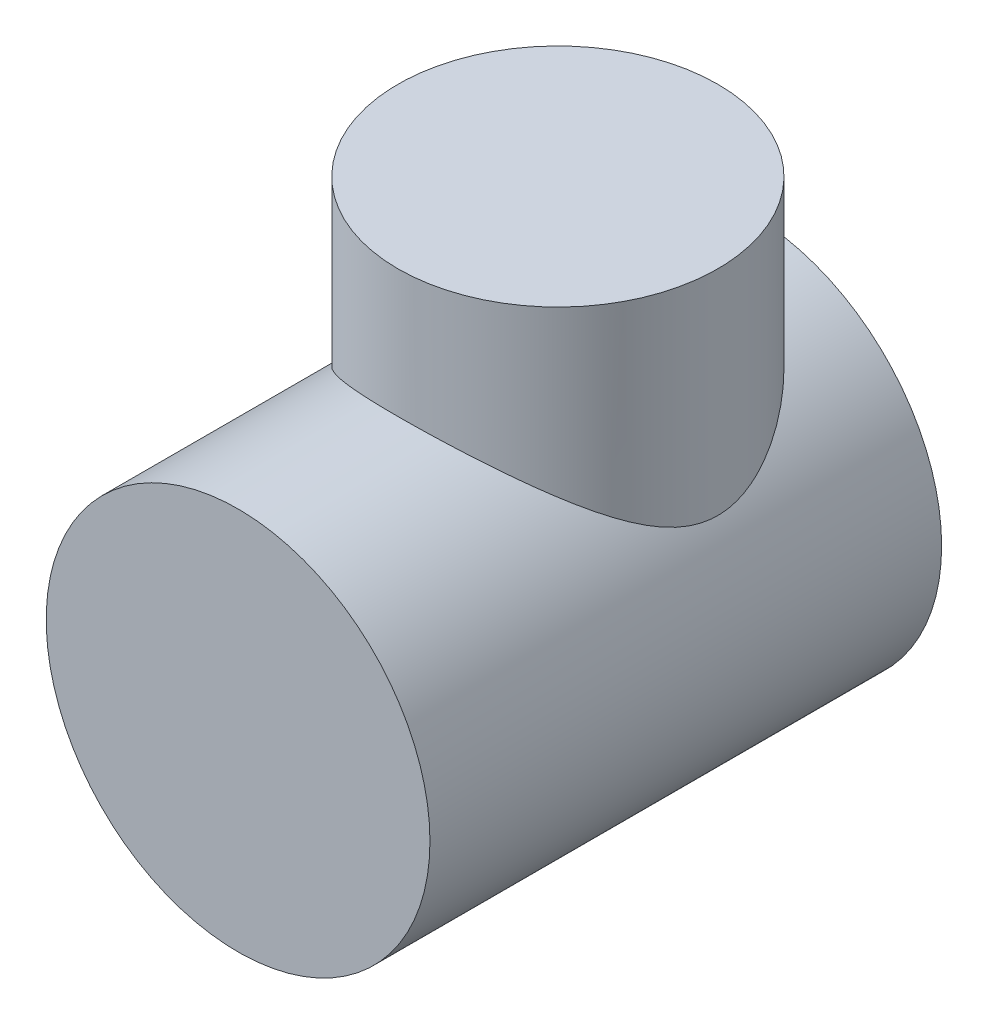
ISO-10303-21;
HEADER;
FILE_DESCRIPTION(('STEP AP214'),'2;1');
FILE_NAME('part.step','',(''),(''),'','','');
FILE_SCHEMA(('AUTOMOTIVE_DESIGN { 1 0 10303 214 1 1 1 1 }'));
ENDSEC;
DATA;
#1=APPLICATION_CONTEXT('core data for automotive mechanical design processes');
#2=APPLICATION_PROTOCOL_DEFINITION('international standard','automotive_design',2000,#1);
#3=PRODUCT_CONTEXT('',#1,'mechanical');
#4=PRODUCT('Part','Part','',(#3));
#5=PRODUCT_RELATED_PRODUCT_CATEGORY('part','',(#4));
#6=PRODUCT_DEFINITION_FORMATION('','',#4);
#7=PRODUCT_DEFINITION_CONTEXT('part definition',#1,'design');
#8=PRODUCT_DEFINITION('design','',#6,#7);
#9=PRODUCT_DEFINITION_SHAPE('','',#8);
#10=(LENGTH_UNIT() NAMED_UNIT(*) SI_UNIT(.MILLI.,.METRE.));
#11=(NAMED_UNIT(*) PLANE_ANGLE_UNIT() SI_UNIT($,.RADIAN.));
#12=(NAMED_UNIT(*) SI_UNIT($,.STERADIAN.) SOLID_ANGLE_UNIT());
#13=UNCERTAINTY_MEASURE_WITH_UNIT(LENGTH_MEASURE(1.E-05),#10,'distance_accuracy_value','');
#14=(GEOMETRIC_REPRESENTATION_CONTEXT(3) GLOBAL_UNCERTAINTY_ASSIGNED_CONTEXT((#13)) GLOBAL_UNIT_ASSIGNED_CONTEXT((#10,
#11,#12)) REPRESENTATION_CONTEXT('',''));
#15=CARTESIAN_POINT('',(0.,0.,0.));
#16=DIRECTION('',(0.,0.,1.));
#17=DIRECTION('',(1.,0.,0.));
#18=AXIS2_PLACEMENT_3D('',#15,#16,#17);
#19=CARTESIAN_POINT('',(0.,0.,800.));
#20=DIRECTION('',(0.,0.,-1.));
#21=DIRECTION('',(-1.,0.,0.));
#22=AXIS2_PLACEMENT_3D('',#19,#20,#21);
#23=CYLINDRICAL_SURFACE('',#22,300.);
#24=CARTESIAN_POINT('',(0.,0.,800.));
#25=DIRECTION('',(0.,0.,1.));
#26=DIRECTION('',(1.,0.,0.));
#27=AXIS2_PLACEMENT_3D('',#24,#25,#26);
#28=CIRCLE('',#27,300.);
#29=CARTESIAN_POINT('',(300.,0.,800.));
#30=VERTEX_POINT('',#29);
#31=EDGE_CURVE('E47',#30,#30,#28,.T.);
#32=ORIENTED_EDGE('',*,*,#31,.F.);
#33=EDGE_LOOP('',(#32));
#34=FACE_BOUND('',#33,.T.);
#35=CARTESIAN_POINT('',(0.,0.,0.));
#36=DIRECTION('',(0.,0.,1.));
#37=DIRECTION('',(1.,0.,0.));
#38=AXIS2_PLACEMENT_3D('',#35,#36,#37);
#39=CIRCLE('',#38,300.);
#40=CARTESIAN_POINT('',(300.,0.,0.));
#41=VERTEX_POINT('',#40);
#42=EDGE_CURVE('E51',#41,#41,#39,.T.);
#43=ORIENTED_EDGE('',*,*,#42,.T.);
#44=EDGE_LOOP('',(#43));
#45=FACE_BOUND('',#44,.T.);
#46=CARTESIAN_POINT('',(0.,300.,50.));
#47=CARTESIAN_POINT('',(-2.96930008322572,299.999997948122,50.0000021093179));
#48=CARTESIAN_POINT('',(-5.93866364297093,299.955892707344,50.0529235240156));
#49=CARTESIAN_POINT('',(-11.8710658877174,299.779726990274,50.2643636130296));
#50=CARTESIAN_POINT('',(-14.834104375777,299.647663814209,50.4228855286365));
#51=CARTESIAN_POINT('',(-20.7478044802737,299.296346726225,50.844793719791));
#52=CARTESIAN_POINT('',(-23.6984648726171,299.07708438727,51.1081901305421));
#53=CARTESIAN_POINT('',(-29.5809762718701,298.552651445318,51.738613006228));
#54=CARTESIAN_POINT('',(-32.5128274219459,298.247481497,52.105638681431));
#55=CARTESIAN_POINT('',(-38.3535997225993,297.552778243481,52.9418893509768));
#56=CARTESIAN_POINT('',(-41.2625065157751,297.163195881416,53.4111737746085));
#57=CARTESIAN_POINT('',(-47.0501391230999,296.301947678224,54.4497436275312));
#58=CARTESIAN_POINT('',(-49.928864851909,295.830281605062,55.0190293395046));
#59=CARTESIAN_POINT('',(-55.6509171431975,294.807432763001,56.2551685649678));
#60=CARTESIAN_POINT('',(-58.494244542241,294.256251877155,56.9220197679378));
#61=CARTESIAN_POINT('',(-64.1408518505144,293.077242087509,58.3506000143364));
#62=CARTESIAN_POINT('',(-66.9441317990373,292.44941325892,59.1123289646677));
#63=CARTESIAN_POINT('',(-72.4894596989027,291.124295763298,60.722830725313));
#64=CARTESIAN_POINT('',(-75.2317763810829,290.427452812313,61.57104591116));
#65=CARTESIAN_POINT('',(-80.6688953530328,288.964453027639,63.3552960600545));
#66=CARTESIAN_POINT('',(-83.3636977107917,288.19829629314,64.291330897427));
#67=CARTESIAN_POINT('',(-88.7023935412724,286.600155550027,66.2480634695666));
#68=CARTESIAN_POINT('',(-91.3462890326043,285.768174158268,67.2687578387748));
#69=CARTESIAN_POINT('',(-96.5804336043644,284.041923083725,69.391683177828));
#70=CARTESIAN_POINT('',(-99.1706825108278,283.147653198992,70.493914412027));
#71=CARTESIAN_POINT('',(-104.295384029534,281.300360145109,72.7768881771682));
#72=CARTESIAN_POINT('',(-106.829830040222,280.347330074696,73.9576399314666));
#73=CARTESIAN_POINT('',(-111.84052450075,278.386305967491,76.3944132869171));
#74=CARTESIAN_POINT('',(-114.316773527055,277.378312475462,77.6504341420597));
#75=CARTESIAN_POINT('',(-119.209636970705,275.310945245439,80.2348572131202));
#76=CARTESIAN_POINT('',(-121.626245765144,274.251566690549,81.5632662162319));
#77=CARTESIAN_POINT('',(-126.398247631344,272.085189052158,84.2894653650219));
#78=CARTESIAN_POINT('',(-128.753638405936,270.978188185786,85.687258108572));
#79=CARTESIAN_POINT('',(-134.256259318215,268.30531289465,89.0753970757047));
#80=CARTESIAN_POINT('',(-137.376412729716,266.720297528871,91.0947411250758));
#81=CARTESIAN_POINT('',(-143.498088466576,263.477320890871,95.2514004643173));
#82=CARTESIAN_POINT('',(-146.499602379744,261.819354463573,97.3887240939275));
#83=CARTESIAN_POINT('',(-152.383317841824,258.43923508653,101.775898224341));
#84=CARTESIAN_POINT('',(-155.265485743067,256.71706429199,104.025780069598));
#85=CARTESIAN_POINT('',(-160.908710429854,253.218105778097,108.632151889252));
#86=CARTESIAN_POINT('',(-163.669769376234,251.44131903417,110.988639960045));
#87=CARTESIAN_POINT('',(-169.077158639631,247.837643031533,115.809696084667));
#88=CARTESIAN_POINT('',(-171.723184868089,246.01063961813,118.27451961817));
#89=CARTESIAN_POINT('',(-176.892986797946,242.319950098432,123.302873878106));
#90=CARTESIAN_POINT('',(-179.416761872879,240.456263804229,125.866405110238));
#91=CARTESIAN_POINT('',(-184.341658658744,236.701793334697,131.088683117942));
#92=CARTESIAN_POINT('',(-186.742798038185,234.811013113426,133.747416083076));
#93=CARTESIAN_POINT('',(-191.422795724422,231.011682441645,139.158127078872));
#94=CARTESIAN_POINT('',(-193.701653929733,229.103131976388,141.910105186918));
#95=CARTESIAN_POINT('',(-198.177775864621,225.243118574277,147.557260728734));
#96=CARTESIAN_POINT('',(-200.372767360237,223.291512102017,150.454141159526));
#97=CARTESIAN_POINT('',(-204.635460679348,219.391597153672,156.342285839977));
#98=CARTESIAN_POINT('',(-206.70316147619,217.443288704311,159.333550850594));
#99=CARTESIAN_POINT('',(-210.711219284542,213.561623952982,165.411594994307));
#100=CARTESIAN_POINT('',(-212.651531745019,211.628273088409,168.498406993174));
#101=CARTESIAN_POINT('',(-216.402739934711,207.790887124252,174.767427081435));
#102=CARTESIAN_POINT('',(-218.213637285177,205.886851657653,177.949633975059));
#103=CARTESIAN_POINT('',(-221.699926748241,202.127922853598,184.403450928727));
#104=CARTESIAN_POINT('',(-223.375631121733,200.272923338017,187.674830170698));
#105=CARTESIAN_POINT('',(-226.593568489109,196.624694948907,194.316639258371));
#106=CARTESIAN_POINT('',(-228.135794388486,194.831469361769,197.687074356249));
#107=CARTESIAN_POINT('',(-231.081703037206,191.328199766915,204.526955299351));
#108=CARTESIAN_POINT('',(-232.485483671598,189.618097428702,207.996328921917));
#109=CARTESIAN_POINT('',(-235.150262749465,186.303182455405,215.038113213859));
#110=CARTESIAN_POINT('',(-236.411287288404,184.698350599765,218.610504901494));
#111=CARTESIAN_POINT('',(-238.895858325864,181.475311195479,226.201716814332));
#112=CARTESIAN_POINT('',(-240.104703258894,179.870064665741,230.230905920635));
#113=CARTESIAN_POINT('',(-242.33276493597,176.856846685082,238.414271995046));
#114=CARTESIAN_POINT('',(-243.352007306969,175.448848580143,242.568431983608));
#115=CARTESIAN_POINT('',(-244.727860441911,173.519156255168,248.883407200736));
#116=CARTESIAN_POINT('',(-245.160648486958,172.906789285015,251.000369485242));
#117=CARTESIAN_POINT('',(-245.974021246627,171.747727856016,255.262038344168));
#118=CARTESIAN_POINT('',(-246.354611226261,171.201026774404,257.406742096499));
#119=CARTESIAN_POINT('',(-247.061896209314,170.178747363233,261.722062845376));
#120=CARTESIAN_POINT('',(-247.388586805505,169.703174849989,263.892681945414));
#121=CARTESIAN_POINT('',(-247.986346846238,168.828470804522,268.256930365709));
#122=CARTESIAN_POINT('',(-248.257416177444,168.429339428059,270.450559732843));
#123=CARTESIAN_POINT('',(-248.745411213406,167.707819483994,274.885097816284));
#124=CARTESIAN_POINT('',(-248.961613372247,167.386458823626,277.126254212998));
#125=CARTESIAN_POINT('',(-249.333972307246,166.831298473036,281.624390733467));
#126=CARTESIAN_POINT('',(-249.490129133211,166.597498710186,283.881370844094));
#127=CARTESIAN_POINT('',(-249.741299554696,166.220740889465,288.406166070146));
#128=CARTESIAN_POINT('',(-249.836317416202,166.077776493545,290.673980418483));
#129=CARTESIAN_POINT('',(-249.964531094187,165.884739204277,295.215320509695));
#130=CARTESIAN_POINT('',(-249.997726953307,165.834666246855,297.48884624863));
#131=CARTESIAN_POINT('',(-250.002047371778,165.828153006173,302.036101265411));
#132=CARTESIAN_POINT('',(-249.973171671694,165.871713114259,304.309830544069));
#133=CARTESIAN_POINT('',(-249.853565883268,166.051820889146,308.851948407242));
#134=CARTESIAN_POINT('',(-249.762835950449,166.188368322143,311.120337005172));
#135=CARTESIAN_POINT('',(-249.520176185657,166.55248247961,315.646691077136));
#136=CARTESIAN_POINT('',(-249.368240702021,166.780057609477,317.904655569139));
#137=CARTESIAN_POINT('',(-249.004234047618,167.32303488141,322.405100221932));
#138=CARTESIAN_POINT('',(-248.792161862288,167.638438505226,324.647580120828));
#139=CARTESIAN_POINT('',(-248.289231522473,168.382527562159,329.297975902584));
#140=CARTESIAN_POINT('',(-247.993297523216,168.818439179297,331.704186027537));
#141=CARTESIAN_POINT('',(-247.334580840791,169.782052426163,336.488870183841));
#142=CARTESIAN_POINT('',(-246.971796483187,170.309756355043,338.867343518866));
#143=CARTESIAN_POINT('',(-246.181617029185,171.449970267447,343.593015085233));
#144=CARTESIAN_POINT('',(-245.754219956287,172.062482845215,345.940212357449));
#145=CARTESIAN_POINT('',(-244.837072421485,173.365054915013,350.600886886734));
#146=CARTESIAN_POINT('',(-244.347314378562,174.055123834117,352.914360005894));
#147=CARTESIAN_POINT('',(-243.306326099892,175.507355463914,357.511755432343));
#148=CARTESIAN_POINT('',(-242.754931440211,176.269710143922,359.795579640868));
#149=CARTESIAN_POINT('',(-241.593942458667,177.857623385843,364.326007332877));
#150=CARTESIAN_POINT('',(-240.984349637132,178.683180318316,366.572611774123));
#151=CARTESIAN_POINT('',(-239.708918101493,180.390603674482,371.028196184226));
#152=CARTESIAN_POINT('',(-239.043077093819,181.27247239398,373.237174614432));
#153=CARTESIAN_POINT('',(-237.656948259697,183.085985485108,377.617344137849));
#154=CARTESIAN_POINT('',(-236.936657213434,184.017632799359,379.78853298708));
#155=CARTESIAN_POINT('',(-235.003540875399,186.486018450571,385.360641582017));
#156=CARTESIAN_POINT('',(-233.75041778992,188.056056955912,388.732937346731));
#157=CARTESIAN_POINT('',(-231.11611712962,191.284297755571,395.384157765142));
#158=CARTESIAN_POINT('',(-229.734923235306,192.942511274124,398.663070449673));
#159=CARTESIAN_POINT('',(-226.848018610506,196.328624589522,405.130985444804));
#160=CARTESIAN_POINT('',(-225.342248349512,198.05655749831,408.319943782035));
#161=CARTESIAN_POINT('',(-222.209971344436,201.564526338808,414.608319672994));
#162=CARTESIAN_POINT('',(-220.583469047678,203.344560349845,417.707740519116));
#163=CARTESIAN_POINT('',(-217.209683530609,206.944551822976,423.823117916728));
#164=CARTESIAN_POINT('',(-215.462241344305,208.764559598374,426.838957029131));
#165=CARTESIAN_POINT('',(-211.850087095521,212.429189124715,432.784181314423));
#166=CARTESIAN_POINT('',(-209.985374333581,214.273811022417,435.713565971502));
#167=CARTESIAN_POINT('',(-206.140124402772,217.975618475882,441.485945756221));
#168=CARTESIAN_POINT('',(-204.159612195528,219.832801248262,444.328959302622));
#169=CARTESIAN_POINT('',(-200.083004158149,223.549547434644,449.929272737777));
#170=CARTESIAN_POINT('',(-197.986907838691,225.409110858693,452.686572263584));
#171=CARTESIAN_POINT('',(-193.566666700585,229.218011530603,458.256881062004));
#172=CARTESIAN_POINT('',(-191.236327946516,231.166952316317,461.065250417447));
#173=CARTESIAN_POINT('',(-186.44809238301,235.045958959619,466.584682651907));
#174=CARTESIAN_POINT('',(-183.990194378162,236.97602464012,469.295744618612));
#175=CARTESIAN_POINT('',(-178.946453415386,240.807388308361,474.618473884564));
#176=CARTESIAN_POINT('',(-176.360589451152,242.708681505604,477.230124739616));
#177=CARTESIAN_POINT('',(-171.061353319848,246.472260152215,482.350177392233));
#178=CARTESIAN_POINT('',(-168.347982126163,248.334545899208,484.858579977717));
#179=CARTESIAN_POINT('',(-162.799084179718,252.006957991021,489.763390180969));
#180=CARTESIAN_POINT('',(-159.963794072188,253.817174926226,492.159997469123));
#181=CARTESIAN_POINT('',(-154.166804641731,257.379428105951,496.8412453973));
#182=CARTESIAN_POINT('',(-151.205103038213,259.131463299799,499.125884015698));
#183=CARTESIAN_POINT('',(-145.157157670053,262.567118669463,503.576748741205));
#184=CARTESIAN_POINT('',(-142.070948711506,264.250757704923,505.743007548171));
#185=CARTESIAN_POINT('',(-135.774902853871,267.540256480302,509.951210318961));
#186=CARTESIAN_POINT('',(-132.565074488622,269.146121571986,511.993162839016));
#187=CARTESIAN_POINT('',(-126.823862949777,271.888224403703,515.462392195908));
#188=CARTESIAN_POINT('',(-124.318465992255,273.043293487801,516.917896676982));
#189=CARTESIAN_POINT('',(-119.239866680083,275.299061784829,519.750557170931));
#190=CARTESIAN_POINT('',(-116.666667059873,276.399763185244,521.127716336373));
#191=CARTESIAN_POINT('',(-111.454395558452,278.542378654731,523.800121396841));
#192=CARTESIAN_POINT('',(-108.815329517045,279.584297908987,525.095374518036));
#193=CARTESIAN_POINT('',(-103.473234050777,281.605122677598,527.600512119238));
#194=CARTESIAN_POINT('',(-100.770204006976,282.584027581859,528.810395772726));
#195=CARTESIAN_POINT('',(-95.3038500792348,284.474139907904,531.140650878781));
#196=CARTESIAN_POINT('',(-92.5405490308462,285.385372412281,532.261055508233));
#197=CARTESIAN_POINT('',(-86.9558051955792,287.136294268923,534.409126546956));
#198=CARTESIAN_POINT('',(-84.1343626129723,287.975983872489,535.436793281979));
#199=CARTESIAN_POINT('',(-78.4368562509303,289.579726684694,537.395733937981));
#200=CARTESIAN_POINT('',(-75.560790298173,290.343776876292,538.327004014038));
#201=CARTESIAN_POINT('',(-69.7583377621548,291.792247622954,540.089499693543));
#202=CARTESIAN_POINT('',(-66.8319510852652,292.476668029837,540.920725110821));
#203=CARTESIAN_POINT('',(-60.9106451964293,293.767163189716,542.48575980138));
#204=CARTESIAN_POINT('',(-57.9153698032813,294.372586492576,543.218760251686));
#205=CARTESIAN_POINT('',(-51.8839702260125,295.495284245551,544.576386227993));
#206=CARTESIAN_POINT('',(-48.8478459898108,296.012558583268,545.201011615807));
#207=CARTESIAN_POINT('',(-42.7406593926878,296.955860206389,546.338962019991));
#208=CARTESIAN_POINT('',(-39.6695963097707,297.381885602554,546.852284731929));
#209=CARTESIAN_POINT('',(-33.4990685315885,298.140025401008,547.76508908882));
#210=CARTESIAN_POINT('',(-30.3996039192736,298.472140077484,548.164571066149));
#211=CARTESIAN_POINT('',(-24.180768978529,299.040188579491,548.847484016098));
#212=CARTESIAN_POINT('',(-21.061409816137,299.276172233824,549.130975112065));
#213=CARTESIAN_POINT('',(-14.8083797791352,299.650666532306,549.580723361502));
#214=CARTESIAN_POINT('',(-11.6747088007873,299.789176468792,549.746979663842));
#215=CARTESIAN_POINT('',(-5.40082614644589,299.967796067868,549.961361377547));
#216=CARTESIAN_POINT('',(-2.26061511430501,300.007914997318,550.009497913904));
#217=CARTESIAN_POINT('',(4.01904355872492,299.989508271688,549.987410005977));
#218=CARTESIAN_POINT('',(7.15849121919319,299.930985491158,549.917189010788));
#219=CARTESIAN_POINT('',(13.0528242787446,299.728621349536,549.674288295941));
#220=CARTESIAN_POINT('',(15.8086539837901,299.595859631347,549.514913226795));
#221=CARTESIAN_POINT('',(21.308833517296,299.254949937809,549.105475567758));
#222=CARTESIAN_POINT('',(24.0531836476061,299.046803957416,548.855415377742));
#223=CARTESIAN_POINT('',(29.5252745005675,298.556198731241,548.265645152287));
#224=CARTESIAN_POINT('',(32.2530167629405,298.273746485157,547.925943561116));
#225=CARTESIAN_POINT('',(37.6874694627792,297.635918133996,547.15821937132));
#226=CARTESIAN_POINT('',(40.3941797460955,297.280541494958,546.730196125993));
#227=CARTESIAN_POINT('',(45.7821830386138,296.498571052139,545.787452793534));
#228=CARTESIAN_POINT('',(48.4634750538068,296.071974475266,545.272729330549));
#229=CARTESIAN_POINT('',(53.796345472515,295.149582224017,544.158500880524));
#230=CARTESIAN_POINT('',(56.4479239365318,294.65378669057,543.558996066146));
#231=CARTESIAN_POINT('',(61.7175933000284,293.595234163951,542.277304076488));
#232=CARTESIAN_POINT('',(64.3356830355543,293.032474850315,541.595114035937));
#233=CARTESIAN_POINT('',(69.5347473339,291.842475778192,540.150366350436));
#234=CARTESIAN_POINT('',(72.1157217910235,291.215235836121,539.387808476667));
#235=CARTESIAN_POINT('',(77.2713484761628,289.89018013418,537.774118448574));
#236=CARTESIAN_POINT('',(79.8454621384835,289.19153815711,536.921945031621));
#237=CARTESIAN_POINT('',(84.949331110106,287.733652936289,535.140207781073));
#238=CARTESIAN_POINT('',(87.4790863435418,286.974409588904,534.210643815134));
#239=CARTESIAN_POINT('',(92.4914335145442,285.398381502764,532.276882258264));
#240=CARTESIAN_POINT('',(94.9740290991053,284.581601236698,531.272690468268));
#241=CARTESIAN_POINT('',(99.8901823120477,282.893454700713,529.192225796989));
#242=CARTESIAN_POINT('',(102.323736145459,282.022084227744,528.115947365117));
#243=CARTESIAN_POINT('',(107.139890623938,280.227850463832,525.893952373519));
#244=CARTESIAN_POINT('',(109.522486545225,279.304982427455,524.748229413729));
#245=CARTESIAN_POINT('',(114.235034711795,277.410898144473,522.389972578652));
#246=CARTESIAN_POINT('',(116.564982813951,276.439678111933,521.1774334709));
#247=CARTESIAN_POINT('',(121.170830119886,274.452038333958,518.688095126997));
#248=CARTESIAN_POINT('',(123.446726032023,273.435615846578,517.411291992021));
#249=CARTESIAN_POINT('',(127.943246242451,271.360751468667,514.795928956309));
#250=CARTESIAN_POINT('',(130.163868489025,270.302308022123,513.457366768371));
#251=CARTESIAN_POINT('',(135.534661318531,267.661906934082,510.105663594656));
#252=CARTESIAN_POINT('',(138.653954142602,266.058501447342,508.059772352012));
#253=CARTESIAN_POINT('',(144.772523961591,262.779310655526,503.849721966544));
#254=CARTESIAN_POINT('',(147.771791196016,261.103519486987,501.685553239098));
#255=CARTESIAN_POINT('',(153.649801267292,257.688369036681,497.244294727559));
#256=CARTESIAN_POINT('',(156.528504888171,255.948989410677,494.967168719719));
#257=CARTESIAN_POINT('',(162.163497232381,252.416437997989,490.305991238745));
#258=CARTESIAN_POINT('',(164.91978847016,250.623267317484,487.921941963924));
#259=CARTESIAN_POINT('',(170.317233347735,246.987161920001,483.044551548286));
#260=CARTESIAN_POINT('',(172.958040667988,245.144101215727,480.550921374285));
#261=CARTESIAN_POINT('',(178.116097631603,241.422389016808,475.464456688526));
#262=CARTESIAN_POINT('',(180.633346539431,239.543737310384,472.871621586372));
#263=CARTESIAN_POINT('',(185.543856252445,235.760645328604,467.590206164944));
#264=CARTESIAN_POINT('',(187.937136769788,233.856209214338,464.901641183068));
#265=CARTESIAN_POINT('',(192.600112282691,230.031063820386,459.430599094671));
#266=CARTESIAN_POINT('',(194.869807208492,228.110354531515,456.648121935142));
#267=CARTESIAN_POINT('',(199.324982083751,224.228534824826,450.940031660797));
#268=CARTESIAN_POINT('',(201.508228001727,222.26731652996,448.012748116788));
#269=CARTESIAN_POINT('',(205.746110997389,218.350321980402,442.06293746616));
#270=CARTESIAN_POINT('',(207.800746995474,216.394545771525,439.040409560344));
#271=CARTESIAN_POINT('',(211.781310208026,212.500426539375,432.898733034082));
#272=CARTESIAN_POINT('',(213.707188864169,210.562090329098,429.779548603305));
#273=CARTESIAN_POINT('',(217.427971422577,206.717760088642,423.444608152237));
#274=CARTESIAN_POINT('',(219.222877067611,204.811765628371,420.228853417744));
#275=CARTESIAN_POINT('',(222.674985286435,201.053087859242,413.707632285033));
#276=CARTESIAN_POINT('',(224.332542517588,199.200275869349,410.402428163122));
#277=CARTESIAN_POINT('',(227.512299537149,195.560713475885,403.69156686864));
#278=CARTESIAN_POINT('',(229.034491647839,193.7739668228,400.285904012764));
#279=CARTESIAN_POINT('',(231.938077602778,190.288906158057,393.374340763365));
#280=CARTESIAN_POINT('',(233.319578352078,188.590525488345,389.868519109522));
#281=CARTESIAN_POINT('',(235.937248251353,185.305222931668,382.752541851229));
#282=CARTESIAN_POINT('',(237.173445851014,183.718279250433,379.142406843882));
#283=CARTESIAN_POINT('',(239.585703396164,180.562843571261,371.525461797657));
#284=CARTESIAN_POINT('',(240.749223376935,179.005791353204,367.509895826973));
#285=CARTESIAN_POINT('',(242.88789577652,176.09297938141,359.356715147805));
#286=CARTESIAN_POINT('',(243.863074154532,174.737191893243,355.219117349764));
#287=CARTESIAN_POINT('',(245.173857915578,172.888255967394,348.932122634384));
#288=CARTESIAN_POINT('',(245.585135432565,172.303204684878,346.825070795445));
#289=CARTESIAN_POINT('',(246.355869262762,171.199412334806,342.584368860737));
#290=CARTESIAN_POINT('',(246.715330845038,170.680664525582,340.450721493424));
#291=CARTESIAN_POINT('',(247.380791988339,169.714725280896,336.158817084271));
#292=CARTESIAN_POINT('',(247.686787405134,169.267539392513,334.000558148557));
#293=CARTESIAN_POINT('',(248.243671699796,168.449768028941,329.662458839119));
#294=CARTESIAN_POINT('',(248.494560473417,168.079182698657,327.482618424578));
#295=CARTESIAN_POINT('',(248.942402417156,167.415180857807,323.078914647561));
#296=CARTESIAN_POINT('',(249.138679973709,167.122732625073,320.854835871708));
#297=CARTESIAN_POINT('',(249.472024583795,166.624724744646,316.392517063379));
#298=CARTESIAN_POINT('',(249.609091683503,166.419165029195,314.154277041948));
#299=CARTESIAN_POINT('',(249.823055871559,166.097796926918,309.668610872369));
#300=CARTESIAN_POINT('',(249.899956812644,165.981982793242,307.42118532168));
#301=CARTESIAN_POINT('',(249.993045788045,165.84174443402,302.922215998362));
#302=CARTESIAN_POINT('',(250.00923382665,165.817320202017,300.670672226023));
#303=CARTESIAN_POINT('',(249.980774323819,165.860221620894,296.168354831911));
#304=CARTESIAN_POINT('',(249.936113476496,165.9275673392,293.917581486271));
#305=CARTESIAN_POINT('',(249.786261173285,166.153067860318,289.422638371619));
#306=CARTESIAN_POINT('',(249.681069905154,166.311222381456,287.178468582144));
#307=CARTESIAN_POINT('',(249.410892694583,166.716123144881,282.701556842633));
#308=CARTESIAN_POINT('',(249.24590078987,166.962878220843,280.468816054615));
#309=CARTESIAN_POINT('',(248.857240437387,167.541622047205,276.019568259933));
#310=CARTESIAN_POINT('',(248.633570818738,167.873612498423,273.803061578119));
#311=CARTESIAN_POINT('',(248.102154893374,168.658140987241,269.155949947675));
#312=CARTESIAN_POINT('',(247.788002340057,169.119736771214,266.727606126649));
#313=CARTESIAN_POINT('',(247.091789616283,170.135317005869,261.900189806913));
#314=CARTESIAN_POINT('',(246.709727326331,170.689304340102,259.501118224302));
#315=CARTESIAN_POINT('',(245.880028642758,171.882341179909,254.735647727806));
#316=CARTESIAN_POINT('',(245.432388967701,172.521394941987,252.369250455404));
#317=CARTESIAN_POINT('',(244.473875442818,173.877005878963,247.671497389013));
#318=CARTESIAN_POINT('',(243.962993876614,174.593572510144,245.340145910085));
#319=CARTESIAN_POINT('',(242.878890002966,176.098571835625,240.708197045154));
#320=CARTESIAN_POINT('',(242.305502503616,176.887194024946,238.407700124758));
#321=CARTESIAN_POINT('',(241.099739001024,178.527173278706,233.845000546315));
#322=CARTESIAN_POINT('',(240.467364537613,179.378528705398,231.582796890459));
#323=CARTESIAN_POINT('',(239.145578438023,181.136970171602,227.096911111839));
#324=CARTESIAN_POINT('',(238.456162940398,182.044059983035,224.873231609346));
#325=CARTESIAN_POINT('',(237.022161386588,183.90725248243,220.464675118892));
#326=CARTESIAN_POINT('',(236.277575874715,184.863354686803,218.27979774837));
#327=CARTESIAN_POINT('',(234.278958546712,187.39608017822,212.66874746356));
#328=CARTESIAN_POINT('',(232.98386215367,189.005553736441,209.271919092992));
#329=CARTESIAN_POINT('',(230.263265519125,192.310717492202,202.573626525968));
#330=CARTESIAN_POINT('',(228.837748794823,194.006418575298,199.272174452938));
#331=CARTESIAN_POINT('',(225.859755546577,197.465393368957,192.761050440539));
#332=CARTESIAN_POINT('',(224.307218638598,199.228699003851,189.551423143757));
#333=CARTESIAN_POINT('',(221.07889174883,202.805146180965,183.223550342843));
#334=CARTESIAN_POINT('',(219.4031062874,204.618285893906,180.105301493105));
#335=CARTESIAN_POINT('',(215.928085870233,208.282129638755,173.954150495822));
#336=CARTESIAN_POINT('',(214.128689415839,210.132880499641,170.921367591796));
#337=CARTESIAN_POINT('',(210.409912209868,213.856477538701,164.944242883266));
#338=CARTESIAN_POINT('',(208.490530738835,215.729323849309,161.999901609234));
#339=CARTESIAN_POINT('',(204.533152821653,219.484918585745,156.199749173793));
#340=CARTESIAN_POINT('',(202.495181811329,221.367664809949,153.343919227849));
#341=CARTESIAN_POINT('',(198.300782818448,225.132721233022,147.720310519586));
#342=CARTESIAN_POINT('',(196.144354355271,227.015031430092,144.952532114591));
#343=CARTESIAN_POINT('',(191.604333257958,230.861562900524,139.372025306729));
#344=CARTESIAN_POINT('',(189.214784573877,232.825261168684,136.563777750234));
#345=CARTESIAN_POINT('',(184.305632736446,236.730377549833,131.047146237446));
#346=CARTESIAN_POINT('',(181.786028390307,238.671795458279,128.338763197439));
#347=CARTESIAN_POINT('',(176.616333180951,242.522289314705,123.024251930816));
#348=CARTESIAN_POINT('',(173.966219442711,244.43135951356,120.418141774943));
#349=CARTESIAN_POINT('',(168.536015160366,248.20666103693,115.312425947372));
#350=CARTESIAN_POINT('',(165.755925664215,250.072892706658,112.812819417277));
#351=CARTESIAN_POINT('',(160.0713913808,253.749059482461,107.929274247093));
#352=CARTESIAN_POINT('',(157.167190263859,255.559093850693,105.5451269415));
#353=CARTESIAN_POINT('',(151.230148571017,259.116611229278,100.892830427925));
#354=CARTESIAN_POINT('',(148.197305428975,260.864092990553,98.6246835359025));
#355=CARTESIAN_POINT('',(142.005216531038,264.285882015764,94.2113491855745));
#356=CARTESIAN_POINT('',(138.84601108228,265.96021226264,92.0661230407478));
#357=CARTESIAN_POINT('',(132.40230299365,269.226065692311,87.9048873510454));
#358=CARTESIAN_POINT('',(129.117809969951,270.817595208219,85.8888679208981));
#359=CARTESIAN_POINT('',(123.293028621159,273.507380079298,82.4981416561605));
#360=CARTESIAN_POINT('',(120.780323206443,274.626630372461,81.092573501016));
#361=CARTESIAN_POINT('',(115.689166617521,276.809839569877,78.3598349921663));
#362=CARTESIAN_POINT('',(113.110718218695,277.87380080245,77.0326613368087));
#363=CARTESIAN_POINT('',(107.890051944852,279.942172065978,74.4601931380104));
#364=CARTESIAN_POINT('',(105.247837658254,280.946585437039,73.2148940017101));
#365=CARTESIAN_POINT('',(99.901763302387,282.891725806253,70.8096228572692));
#366=CARTESIAN_POINT('',(97.1979027638662,283.832452319403,69.6496514989302));
#367=CARTESIAN_POINT('',(91.7341411386294,285.645100175817,67.4198107349751));
#368=CARTESIAN_POINT('',(88.9743008728869,286.5170916407,66.3498494266171));
#369=CARTESIAN_POINT('',(83.399088177915,288.189280994177,64.3022894435617));
#370=CARTESIAN_POINT('',(80.5837153767275,288.989478401692,63.3246913877696));
#371=CARTESIAN_POINT('',(74.9015114354321,290.514054153164,61.4655188945725));
#372=CARTESIAN_POINT('',(72.0346855385846,291.238440171764,60.5839347369862));
#373=CARTESIAN_POINT('',(66.2536407067343,292.607720065966,58.9201351820857));
#374=CARTESIAN_POINT('',(63.33942358826,293.252616980332,58.137915986144));
#375=CARTESIAN_POINT('',(57.9685151325609,294.35664452963,56.8005938797704));
#376=CARTESIAN_POINT('',(55.5184442359205,294.82870661913,56.2295004314707));
#377=CARTESIAN_POINT('',(50.5920237044987,295.713898612272,55.1596435762692));
#378=CARTESIAN_POINT('',(48.115674711335,296.127029951251,54.6608784077089));
#379=CARTESIAN_POINT('',(43.1402093001351,296.892669243781,53.7372871435526));
#380=CARTESIAN_POINT('',(40.6410954749188,297.245184012604,53.3124527356698));
#381=CARTESIAN_POINT('',(35.6232691250327,297.888201618016,52.5380287052563));
#382=CARTESIAN_POINT('',(33.1045564291765,298.178703912324,52.1884397407232));
#383=CARTESIAN_POINT('',(28.0513154104947,298.696458362782,51.5656944421922));
#384=CARTESIAN_POINT('',(25.5167876783995,298.923712867102,51.2925352706198));
#385=CARTESIAN_POINT('',(20.4356757480372,299.314008365054,50.8235715323392));
#386=CARTESIAN_POINT('',(17.8890916574839,299.477049931283,50.6277662758519));
#387=CARTESIAN_POINT('',(12.7874967169573,299.738226013644,50.3141740499668));
#388=CARTESIAN_POINT('',(10.2324849319119,299.836353066015,50.1963960520086));
#389=CARTESIAN_POINT('',(5.11833122190153,299.967241824377,50.0393070605136));
#390=CARTESIAN_POINT('',(2.55918918747141,300.000001768479,49.9999981820148));
#391=CARTESIAN_POINT('',(0.,300.,50.));
#392=B_SPLINE_CURVE_WITH_KNOTS('',3,(#46,#47,#48,#49,#50,#51,#52,#53,#54,#55,#56,#57,#58,#59,
#60,#61,#62,#63,#64,#65,#66,#67,#68,#69,#70,#71,#72,#73,#74,#75,#76,#77,#78,#79,#80,#81,#82,#83,
#84,#85,#86,#87,#88,#89,#90,#91,#92,#93,#94,#95,#96,#97,#98,#99,#100,#101,#102,#103,#104,#105,
#106,#107,#108,#109,#110,#111,#112,#113,#114,#115,#116,#117,#118,#119,#120,#121,#122,#123,#124,
#125,#126,#127,#128,#129,#130,#131,#132,#133,#134,#135,#136,#137,#138,#139,#140,#141,#142,#143,
#144,#145,#146,#147,#148,#149,#150,#151,#152,#153,#154,#155,#156,#157,#158,#159,#160,#161,#162,
#163,#164,#165,#166,#167,#168,#169,#170,#171,#172,#173,#174,#175,#176,#177,#178,#179,#180,#181,
#182,#183,#184,#185,#186,#187,#188,#189,#190,#191,#192,#193,#194,#195,#196,#197,#198,#199,#200,
#201,#202,#203,#204,#205,#206,#207,#208,#209,#210,#211,#212,#213,#214,#215,#216,#217,#218,#219,
#220,#221,#222,#223,#224,#225,#226,#227,#228,#229,#230,#231,#232,#233,#234,#235,#236,#237,#238,
#239,#240,#241,#242,#243,#244,#245,#246,#247,#248,#249,#250,#251,#252,#253,#254,#255,#256,#257,
#258,#259,#260,#261,#262,#263,#264,#265,#266,#267,#268,#269,#270,#271,#272,#273,#274,#275,#276,
#277,#278,#279,#280,#281,#282,#283,#284,#285,#286,#287,#288,#289,#290,#291,#292,#293,#294,#295,
#296,#297,#298,#299,#300,#301,#302,#303,#304,#305,#306,#307,#308,#309,#310,#311,#312,#313,#314,
#315,#316,#317,#318,#319,#320,#321,#322,#323,#324,#325,#326,#327,#328,#329,#330,#331,#332,#333,
#334,#335,#336,#337,#338,#339,#340,#341,#342,#343,#344,#345,#346,#347,#348,#349,#350,#351,#352,
#353,#354,#355,#356,#357,#358,#359,#360,#361,#362,#363,#364,#365,#366,#367,#368,#369,#370,#371,
#372,#373,#374,#375,#376,#377,#378,#379,#380,#381,#382,#383,#384,#385,#386,#387,#388,#389,#390,
#391),.UNSPECIFIED.,.T.,.F.,(4,2,2,2,2,2,2,2,2,2,2,2,2,2,2,2,2,2,2,2,2,2,2,2,2,2,2,2,2,2,2,2,2,
2,2,2,2,2,2,2,2,2,2,2,2,2,2,2,2,2,2,2,2,2,2,2,2,2,2,2,2,2,2,2,2,2,2,2,2,2,2,2,2,2,2,2,2,2,2,2,2,
2,2,2,2,2,2,2,2,2,2,2,2,2,2,2,2,2,2,2,2,2,2,2,2,2,2,2,2,2,2,2,2,2,2,2,2,2,2,2,2,2,2,2,2,2,2,2,2,
2,2,2,2,2,2,2,2,2,2,2,2,2,2,2,2,2,2,2,2,2,2,2,2,2,2,2,2,2,2,2,2,2,2,2,2,2,2,2,2,2,2,2,4),(0.,
8.90721319353442,17.814699796726,26.7230474396896,35.631327196282,44.5447980145241,
53.4582940296582,62.3715789919233,71.2848552082367,80.1439165468704,89.002965207874,
97.8616618544898,106.720387223505,115.580155020651,124.439835021105,133.300347149191,
142.161191283918,154.278088546361,166.39584342754,178.516991769512,190.63792375684,
202.789159051699,214.940456607948,227.089998521591,239.239550518469,251.612607668718,
263.985764599903,276.363225947602,288.740532209328,301.08837891422,313.436881516454,
325.776589797998,338.114038756346,351.612834404718,365.109804208859,371.845910110502,
378.58133606728,385.317312491544,392.053302641255,398.873978579547,405.694648860262,
412.51484317552,419.33503278647,426.155250903035,432.975451871108,439.796282754401,
446.61722871855,454.003933707824,461.390823740834,468.777939784102,476.165954713923,
483.574170962124,490.982196280684,498.390523814097,505.799289770201,517.570169469803,
529.342551146838,541.120591274622,552.898197757906,564.69159029074,576.485053171822,
588.275983170477,600.066963089657,612.475194786359,624.883542786802,637.293934485774,
649.704231459782,662.091440710271,674.478873533011,686.862867117718,699.246007323138,
708.601723731235,717.957063404538,727.311576547057,736.666180244502,746.017299196864,
755.368385301081,764.719844243451,774.07132058739,783.495603331693,792.919898092768,
802.344387957753,811.76885030611,821.188421319287,830.608060718239,840.026812903652,
849.445290618866,857.73367563619,866.02184132712,874.309226546965,882.596672450217,
890.884441117088,899.172192905653,907.460231969733,915.748294631718,924.14635964942,
932.544439028886,940.9418662943,949.339940897077,957.73879065349,966.138299072639,
974.538317695954,982.9386476579,995.115181492609,1007.29270352047,1019.47415627073,
1031.65535868848,1043.87088528687,1056.0864845947,1068.30013550522,1080.51379330979,
1092.94602764229,1105.37836632174,1117.81536747153,1130.25220310027,1142.6558531639,
1155.06020629673,1167.45506246675,1179.84748772426,1193.22249843263,1206.59566434019,
1213.26954025718,1219.94273704077,1226.61645084287,1233.29017726945,1240.04312623312,
1246.79606993056,1253.54858116822,1260.30109192892,1267.05507950491,1273.80904613112,
1280.56368633003,1287.31846132409,1294.79058357841,1302.2629390822,1309.73566862401,
1317.20931084159,1324.7032066876,1332.19690696326,1339.69111494759,1347.1852490033,
1359.10737709402,1371.03101401557,1382.9603526152,1394.88925390327,1406.83404821237,
1418.77891415201,1430.72122745868,1442.66358922272,1455.19312593963,1467.72277759004,
1480.25463324517,1492.78638787714,1505.29457756496,1517.80301688259,1530.3074975812,
1542.81102044945,1552.07606752947,1561.34072412537,1570.60486056387,1579.86906754479,
1589.12369771102,1598.37838988604,1607.63214426902,1616.8855447833,1624.56276795316,
1632.23980410186,1639.91597653681,1647.59221609474,1655.26817062255,1662.94405670092,
1670.62082518635,1678.29780058677),.UNSPECIFIED.);
#393=CARTESIAN_POINT('',(0.,300.,50.));
#394=VERTEX_POINT('',#393);
#395=EDGE_CURVE('E10',#394,#394,#392,.T.);
#396=ORIENTED_EDGE('',*,*,#395,.F.);
#397=EDGE_LOOP('',(#396));
#398=FACE_BOUND('',#397,.T.);
#399=ADVANCED_FACE('F36',(#34,#45,#398),#23,.T.);
#400=CARTESIAN_POINT('',(0.,0.,800.));
#401=DIRECTION('',(0.,0.,1.));
#402=DIRECTION('',(1.,0.,0.));
#403=AXIS2_PLACEMENT_3D('',#400,#401,#402);
#404=PLANE('',#403);
#405=ORIENTED_EDGE('',*,*,#31,.T.);
#406=EDGE_LOOP('',(#405));
#407=FACE_BOUND('',#406,.T.);
#408=ADVANCED_FACE('F71',(#407),#404,.T.);
#409=CARTESIAN_POINT('',(0.,0.,0.));
#410=DIRECTION('',(0.,0.,1.));
#411=DIRECTION('',(1.,0.,0.));
#412=AXIS2_PLACEMENT_3D('',#409,#410,#411);
#413=PLANE('',#412);
#414=ORIENTED_EDGE('',*,*,#42,.F.);
#415=EDGE_LOOP('',(#414));
#416=FACE_BOUND('',#415,.T.);
#417=ADVANCED_FACE('F65',(#416),#413,.F.);
#418=CARTESIAN_POINT('',(0.,500.,300.));
#419=DIRECTION('',(0.,-1.,0.));
#420=DIRECTION('',(0.,0.,-1.));
#421=AXIS2_PLACEMENT_3D('',#418,#419,#420);
#422=CYLINDRICAL_SURFACE('',#421,250.);
#423=CARTESIAN_POINT('',(0.,500.,300.));
#424=DIRECTION('',(0.,1.,0.));
#425=DIRECTION('',(0.,0.,1.));
#426=AXIS2_PLACEMENT_3D('',#423,#424,#425);
#427=CIRCLE('',#426,250.);
#428=CARTESIAN_POINT('',(0.,500.,550.));
#429=VERTEX_POINT('',#428);
#430=EDGE_CURVE('E56',#429,#429,#427,.T.);
#431=ORIENTED_EDGE('',*,*,#430,.F.);
#432=EDGE_LOOP('',(#431));
#433=FACE_BOUND('',#432,.T.);
#434=ORIENTED_EDGE('',*,*,#395,.T.);
#435=EDGE_LOOP('',(#434));
#436=FACE_BOUND('',#435,.T.);
#437=ADVANCED_FACE('F63',(#433,#436),#422,.T.);
#438=CARTESIAN_POINT('',(0.,500.,300.));
#439=DIRECTION('',(0.,1.,0.));
#440=DIRECTION('',(0.,0.,1.));
#441=AXIS2_PLACEMENT_3D('',#438,#439,#440);
#442=PLANE('',#441);
#443=ORIENTED_EDGE('',*,*,#430,.T.);
#444=EDGE_LOOP('',(#443));
#445=FACE_BOUND('',#444,.T.);
#446=ADVANCED_FACE('F61',(#445),#442,.T.);
#447=CLOSED_SHELL('',(#399,#408,#417,#437,#446));
#448=MANIFOLD_SOLID_BREP('B2',#447);
#449=ADVANCED_BREP_SHAPE_REPRESENTATION('',(#18,#448),#14);
#450=SHAPE_DEFINITION_REPRESENTATION(#9,#449);
ENDSEC;
END-ISO-10303-21;
